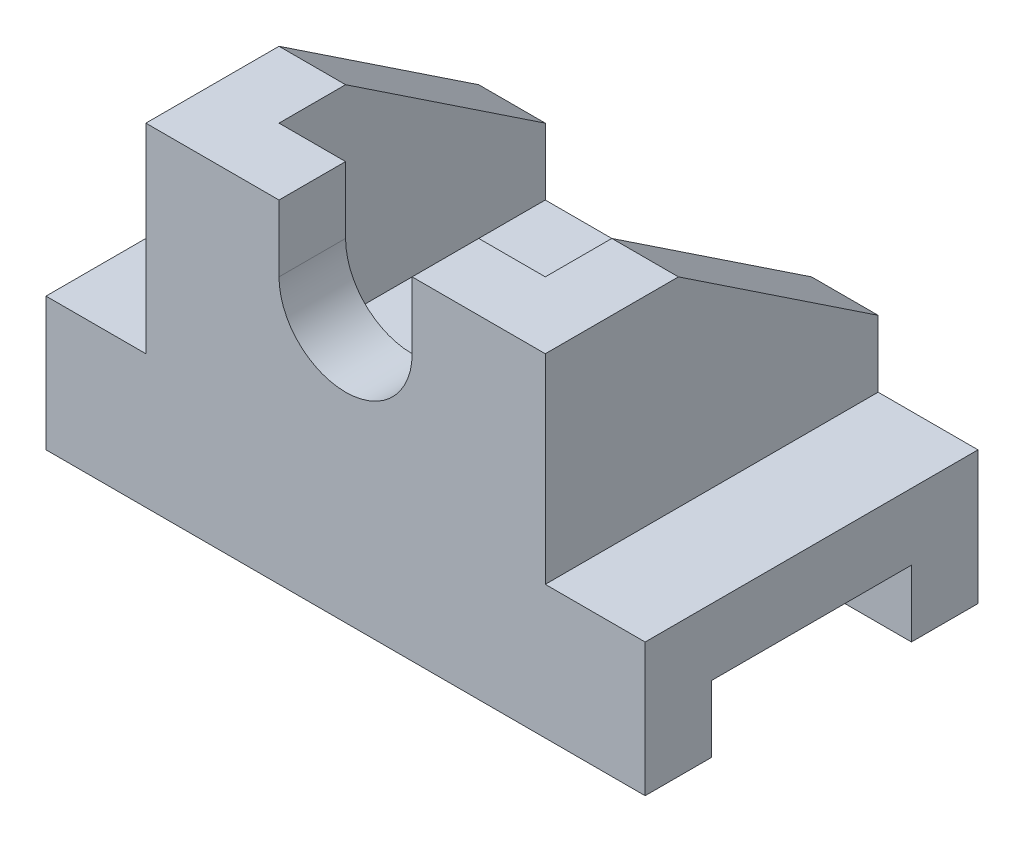
ISO-10303-21;
HEADER;
FILE_DESCRIPTION(('STEP AP214'),'2;1');
FILE_NAME('part.step','',(''),(''),'','','');
FILE_SCHEMA(('AUTOMOTIVE_DESIGN { 1 0 10303 214 1 1 1 1 }'));
ENDSEC;
DATA;
#1=APPLICATION_CONTEXT('core data for automotive mechanical design processes');
#2=APPLICATION_PROTOCOL_DEFINITION('international standard','automotive_design',2000,#1);
#3=PRODUCT_CONTEXT('',#1,'mechanical');
#4=PRODUCT('Part','Part','',(#3));
#5=PRODUCT_RELATED_PRODUCT_CATEGORY('part','',(#4));
#6=PRODUCT_DEFINITION_FORMATION('','',#4);
#7=PRODUCT_DEFINITION_CONTEXT('part definition',#1,'design');
#8=PRODUCT_DEFINITION('design','',#6,#7);
#9=PRODUCT_DEFINITION_SHAPE('','',#8);
#10=(LENGTH_UNIT() NAMED_UNIT(*) SI_UNIT(.MILLI.,.METRE.));
#11=(NAMED_UNIT(*) PLANE_ANGLE_UNIT() SI_UNIT($,.RADIAN.));
#12=(NAMED_UNIT(*) SI_UNIT($,.STERADIAN.) SOLID_ANGLE_UNIT());
#13=UNCERTAINTY_MEASURE_WITH_UNIT(LENGTH_MEASURE(1.E-05),#10,'distance_accuracy_value','');
#14=(GEOMETRIC_REPRESENTATION_CONTEXT(3) GLOBAL_UNCERTAINTY_ASSIGNED_CONTEXT((#13)) GLOBAL_UNIT_ASSIGNED_CONTEXT((#10,
#11,#12)) REPRESENTATION_CONTEXT('',''));
#15=CARTESIAN_POINT('',(0.,0.,0.));
#16=DIRECTION('',(0.,0.,1.));
#17=DIRECTION('',(1.,0.,0.));
#18=AXIS2_PLACEMENT_3D('',#15,#16,#17);
#19=CARTESIAN_POINT('',(60.,60.,10.));
#20=DIRECTION('',(0.,-1.,0.));
#21=DIRECTION('',(0.,0.,-1.));
#22=AXIS2_PLACEMENT_3D('',#19,#20,#21);
#23=PLANE('',#22);
#24=DIRECTION('',(0.,0.,1.));
#25=VECTOR('',#24,1.);
#26=CARTESIAN_POINT('',(-20.,60.,10.));
#27=LINE('',#26,#25);
#28=CARTESIAN_POINT('',(-20.,60.,30.));
#29=VERTEX_POINT('',#28);
#30=CARTESIAN_POINT('',(-20.,60.,50.));
#31=VERTEX_POINT('',#30);
#32=EDGE_CURVE('E223',#29,#31,#27,.T.);
#33=ORIENTED_EDGE('',*,*,#32,.F.);
#34=DIRECTION('',(1.,0.,0.));
#35=VECTOR('',#34,1.);
#36=CARTESIAN_POINT('',(40.,60.,30.));
#37=LINE('',#36,#35);
#38=CARTESIAN_POINT('',(-40.,60.,30.));
#39=VERTEX_POINT('',#38);
#40=EDGE_CURVE('E239',#39,#29,#37,.T.);
#41=ORIENTED_EDGE('',*,*,#40,.F.);
#42=DIRECTION('',(0.,0.,-1.));
#43=VECTOR('',#42,1.);
#44=CARTESIAN_POINT('',(-40.,60.,30.));
#45=LINE('',#44,#43);
#46=CARTESIAN_POINT('',(-40.,60.,10.));
#47=VERTEX_POINT('',#46);
#48=EDGE_CURVE('E251',#39,#47,#45,.T.);
#49=ORIENTED_EDGE('',*,*,#48,.T.);
#50=DIRECTION('',(-1.,0.,0.));
#51=VECTOR('',#50,1.);
#52=CARTESIAN_POINT('',(60.,60.,10.));
#53=LINE('',#52,#51);
#54=CARTESIAN_POINT('',(-60.,60.,10.));
#55=VERTEX_POINT('',#54);
#56=EDGE_CURVE('E314',#47,#55,#53,.T.);
#57=ORIENTED_EDGE('',*,*,#56,.T.);
#58=DIRECTION('',(0.,0.,1.));
#59=VECTOR('',#58,1.);
#60=CARTESIAN_POINT('',(-60.,60.,10.));
#61=LINE('',#60,#59);
#62=CARTESIAN_POINT('',(-60.,60.,50.));
#63=VERTEX_POINT('',#62);
#64=EDGE_CURVE('E308',#55,#63,#61,.T.);
#65=ORIENTED_EDGE('',*,*,#64,.T.);
#66=DIRECTION('',(-1.,0.,0.));
#67=VECTOR('',#66,1.);
#68=CARTESIAN_POINT('',(60.,60.,50.));
#69=LINE('',#68,#67);
#70=EDGE_CURVE('E300',#31,#63,#69,.T.);
#71=ORIENTED_EDGE('',*,*,#70,.F.);
#72=EDGE_LOOP('',(#33,#41,#49,#57,#65,#71));
#73=FACE_BOUND('',#72,.T.);
#74=ADVANCED_FACE('F45',(#73),#23,.F.);
#75=CARTESIAN_POINT('',(60.,20.,-50.));
#76=DIRECTION('',(0.,-0.832050294337844,0.554700196225229));
#77=DIRECTION('',(0.,-0.554700196225229,-0.832050294337844));
#78=AXIS2_PLACEMENT_3D('',#75,#76,#77);
#79=PLANE('',#78);
#80=DIRECTION('',(-1.,0.,0.));
#81=VECTOR('',#80,1.);
#82=CARTESIAN_POINT('',(60.,20.,-50.));
#83=LINE('',#82,#81);
#84=CARTESIAN_POINT('',(60.,20.,-50.));
#85=VERTEX_POINT('',#84);
#86=CARTESIAN_POINT('',(40.,20.,-50.));
#87=VERTEX_POINT('',#86);
#88=EDGE_CURVE('E319',#85,#87,#83,.T.);
#89=ORIENTED_EDGE('',*,*,#88,.T.);
#90=DIRECTION('',(0.,0.554700196225229,0.832050294337844));
#91=VECTOR('',#90,1.);
#92=CARTESIAN_POINT('',(40.,20.,-50.));
#93=LINE('',#92,#91);
#94=CARTESIAN_POINT('',(40.,60.,10.));
#95=VERTEX_POINT('',#94);
#96=EDGE_CURVE('E260',#87,#95,#93,.T.);
#97=ORIENTED_EDGE('',*,*,#96,.T.);
#98=CARTESIAN_POINT('',(60.,60.,10.));
#99=VERTEX_POINT('',#98);
#100=EDGE_CURVE('E315',#99,#95,#53,.T.);
#101=ORIENTED_EDGE('',*,*,#100,.F.);
#102=DIRECTION('',(0.,0.554700196225229,0.832050294337844));
#103=VECTOR('',#102,1.);
#104=CARTESIAN_POINT('',(60.,20.,-50.));
#105=LINE('',#104,#103);
#106=EDGE_CURVE('E293',#85,#99,#105,.T.);
#107=ORIENTED_EDGE('',*,*,#106,.F.);
#108=EDGE_LOOP('',(#89,#97,#101,#107));
#109=FACE_BOUND('',#108,.T.);
#110=ADVANCED_FACE('F426',(#109),#79,.F.);
#111=CARTESIAN_POINT('',(0.,-40.,0.));
#112=DIRECTION('',(0.,1.,0.));
#113=DIRECTION('',(0.,0.,1.));
#114=AXIS2_PLACEMENT_3D('',#111,#112,#113);
#115=PLANE('',#114);
#116=DIRECTION('',(0.,0.,-1.));
#117=VECTOR('',#116,1.);
#118=CARTESIAN_POINT('',(90.,-40.,-50.));
#119=LINE('',#118,#117);
#120=CARTESIAN_POINT('',(90.,-40.,-30.));
#121=VERTEX_POINT('',#120);
#122=CARTESIAN_POINT('',(90.,-40.,-50.));
#123=VERTEX_POINT('',#122);
#124=EDGE_CURVE('E327',#121,#123,#119,.T.);
#125=ORIENTED_EDGE('',*,*,#124,.F.);
#126=DIRECTION('',(-1.,0.,0.));
#127=VECTOR('',#126,1.);
#128=CARTESIAN_POINT('',(0.,-40.,-30.));
#129=LINE('',#128,#127);
#130=CARTESIAN_POINT('',(-90.,-40.,-30.));
#131=VERTEX_POINT('',#130);
#132=EDGE_CURVE('E361',#121,#131,#129,.T.);
#133=ORIENTED_EDGE('',*,*,#132,.T.);
#134=DIRECTION('',(0.,0.,1.));
#135=VECTOR('',#134,1.);
#136=CARTESIAN_POINT('',(-90.,-40.,-50.));
#137=LINE('',#136,#135);
#138=CARTESIAN_POINT('',(-90.,-40.,-50.));
#139=VERTEX_POINT('',#138);
#140=EDGE_CURVE('E331',#139,#131,#137,.T.);
#141=ORIENTED_EDGE('',*,*,#140,.F.);
#142=DIRECTION('',(-1.,0.,0.));
#143=VECTOR('',#142,1.);
#144=CARTESIAN_POINT('',(-90.,-40.,-50.));
#145=LINE('',#144,#143);
#146=EDGE_CURVE('E326',#123,#139,#145,.T.);
#147=ORIENTED_EDGE('',*,*,#146,.F.);
#148=EDGE_LOOP('',(#125,#133,#141,#147));
#149=FACE_BOUND('',#148,.T.);
#150=ADVANCED_FACE('F450',(#149),#115,.F.);
#151=CARTESIAN_POINT('',(0.,0.,0.));
#152=DIRECTION('',(0.,1.,0.));
#153=DIRECTION('',(0.,0.,1.));
#154=AXIS2_PLACEMENT_3D('',#151,#152,#153);
#155=PLANE('',#154);
#156=DIRECTION('',(1.,0.,0.));
#157=VECTOR('',#156,1.);
#158=CARTESIAN_POINT('',(-90.,0.,50.));
#159=LINE('',#158,#157);
#160=CARTESIAN_POINT('',(-90.,0.,50.));
#161=VERTEX_POINT('',#160);
#162=CARTESIAN_POINT('',(-60.,0.,50.));
#163=VERTEX_POINT('',#162);
#164=EDGE_CURVE('E347',#161,#163,#159,.T.);
#165=ORIENTED_EDGE('',*,*,#164,.T.);
#166=DIRECTION('',(0.,0.,-1.));
#167=VECTOR('',#166,1.);
#168=CARTESIAN_POINT('',(-60.,0.,50.));
#169=LINE('',#168,#167);
#170=CARTESIAN_POINT('',(-60.,0.,-50.));
#171=VERTEX_POINT('',#170);
#172=EDGE_CURVE('E283',#163,#171,#169,.T.);
#173=ORIENTED_EDGE('',*,*,#172,.T.);
#174=DIRECTION('',(-1.,0.,0.));
#175=VECTOR('',#174,1.);
#176=CARTESIAN_POINT('',(-90.,0.,-50.));
#177=LINE('',#176,#175);
#178=CARTESIAN_POINT('',(-90.,0.,-50.));
#179=VERTEX_POINT('',#178);
#180=EDGE_CURVE('E340',#171,#179,#177,.T.);
#181=ORIENTED_EDGE('',*,*,#180,.T.);
#182=DIRECTION('',(0.,0.,1.));
#183=VECTOR('',#182,1.);
#184=CARTESIAN_POINT('',(-90.,0.,-50.));
#185=LINE('',#184,#183);
#186=EDGE_CURVE('E343',#179,#161,#185,.T.);
#187=ORIENTED_EDGE('',*,*,#186,.T.);
#188=EDGE_LOOP('',(#165,#173,#181,#187));
#189=FACE_BOUND('',#188,.T.);
#190=ADVANCED_FACE('F392',(#189),#155,.T.);
#191=CARTESIAN_POINT('',(90.,-40.,-50.));
#192=DIRECTION('',(1.,0.,0.));
#193=DIRECTION('',(0.,0.,-1.));
#194=AXIS2_PLACEMENT_3D('',#191,#192,#193);
#195=PLANE('',#194);
#196=DIRECTION('',(0.,1.,0.));
#197=VECTOR('',#196,1.);
#198=CARTESIAN_POINT('',(90.,-60.,-30.));
#199=LINE('',#198,#197);
#200=CARTESIAN_POINT('',(90.,-20.,-30.));
#201=VERTEX_POINT('',#200);
#202=EDGE_CURVE('E263',#121,#201,#199,.T.);
#203=ORIENTED_EDGE('',*,*,#202,.F.);
#204=ORIENTED_EDGE('',*,*,#124,.T.);
#205=DIRECTION('',(0.,1.,0.));
#206=VECTOR('',#205,1.);
#207=CARTESIAN_POINT('',(90.,-40.,-50.));
#208=LINE('',#207,#206);
#209=CARTESIAN_POINT('',(90.,0.,-50.));
#210=VERTEX_POINT('',#209);
#211=EDGE_CURVE('E337',#123,#210,#208,.T.);
#212=ORIENTED_EDGE('',*,*,#211,.T.);
#213=DIRECTION('',(0.,0.,-1.));
#214=VECTOR('',#213,1.);
#215=CARTESIAN_POINT('',(90.,0.,-50.));
#216=LINE('',#215,#214);
#217=CARTESIAN_POINT('',(90.,0.,50.));
#218=VERTEX_POINT('',#217);
#219=EDGE_CURVE('E322',#218,#210,#216,.T.);
#220=ORIENTED_EDGE('',*,*,#219,.F.);
#221=DIRECTION('',(0.,1.,0.));
#222=VECTOR('',#221,1.);
#223=CARTESIAN_POINT('',(90.,-40.,50.));
#224=LINE('',#223,#222);
#225=CARTESIAN_POINT('',(90.,-40.,50.));
#226=VERTEX_POINT('',#225);
#227=EDGE_CURVE('E349',#226,#218,#224,.T.);
#228=ORIENTED_EDGE('',*,*,#227,.F.);
#229=CARTESIAN_POINT('',(90.,-40.,30.));
#230=VERTEX_POINT('',#229);
#231=EDGE_CURVE('E323',#226,#230,#119,.T.);
#232=ORIENTED_EDGE('',*,*,#231,.T.);
#233=DIRECTION('',(0.,-1.,0.));
#234=VECTOR('',#233,1.);
#235=CARTESIAN_POINT('',(90.,-60.,30.));
#236=LINE('',#235,#234);
#237=CARTESIAN_POINT('',(90.,-20.,30.));
#238=VERTEX_POINT('',#237);
#239=EDGE_CURVE('E268',#238,#230,#236,.T.);
#240=ORIENTED_EDGE('',*,*,#239,.F.);
#241=DIRECTION('',(0.,0.,1.));
#242=VECTOR('',#241,1.);
#243=CARTESIAN_POINT('',(90.,-20.,30.));
#244=LINE('',#243,#242);
#245=EDGE_CURVE('E277',#201,#238,#244,.T.);
#246=ORIENTED_EDGE('',*,*,#245,.F.);
#247=EDGE_LOOP('',(#203,#204,#212,#220,#228,#232,#240,#246));
#248=FACE_BOUND('',#247,.T.);
#249=ADVANCED_FACE('F47',(#248),#195,.T.);
#250=CARTESIAN_POINT('',(-90.,-40.,50.));
#251=DIRECTION('',(0.,0.,1.));
#252=DIRECTION('',(1.,0.,0.));
#253=AXIS2_PLACEMENT_3D('',#250,#251,#252);
#254=PLANE('',#253);
#255=DIRECTION('',(0.,-1.,0.));
#256=VECTOR('',#255,1.);
#257=CARTESIAN_POINT('',(20.,0.,50.));
#258=LINE('',#257,#256);
#259=CARTESIAN_POINT('',(20.,60.,50.));
#260=VERTEX_POINT('',#259);
#261=CARTESIAN_POINT('',(20.,40.,50.));
#262=VERTEX_POINT('',#261);
#263=EDGE_CURVE('E197',#260,#262,#258,.T.);
#264=ORIENTED_EDGE('',*,*,#263,.T.);
#265=CARTESIAN_POINT('',(0.,40.,50.));
#266=DIRECTION('',(0.,0.,-1.));
#267=DIRECTION('',(-1.,0.,0.));
#268=AXIS2_PLACEMENT_3D('',#265,#266,#267);
#269=CIRCLE('',#268,20.);
#270=CARTESIAN_POINT('',(-20.,40.,50.));
#271=VERTEX_POINT('',#270);
#272=EDGE_CURVE('E205',#262,#271,#269,.T.);
#273=ORIENTED_EDGE('',*,*,#272,.T.);
#274=DIRECTION('',(0.,-1.,0.));
#275=VECTOR('',#274,1.);
#276=CARTESIAN_POINT('',(-20.,0.,50.));
#277=LINE('',#276,#275);
#278=EDGE_CURVE('E201',#31,#271,#277,.T.);
#279=ORIENTED_EDGE('',*,*,#278,.F.);
#280=ORIENTED_EDGE('',*,*,#70,.T.);
#281=DIRECTION('',(0.,-1.,0.));
#282=VECTOR('',#281,1.);
#283=CARTESIAN_POINT('',(-60.,60.,50.));
#284=LINE('',#283,#282);
#285=EDGE_CURVE('E291',#63,#163,#284,.T.);
#286=ORIENTED_EDGE('',*,*,#285,.T.);
#287=ORIENTED_EDGE('',*,*,#164,.F.);
#288=DIRECTION('',(0.,1.,0.));
#289=VECTOR('',#288,1.);
#290=CARTESIAN_POINT('',(-90.,-40.,50.));
#291=LINE('',#290,#289);
#292=CARTESIAN_POINT('',(-90.,-40.,50.));
#293=VERTEX_POINT('',#292);
#294=EDGE_CURVE('E353',#293,#161,#291,.T.);
#295=ORIENTED_EDGE('',*,*,#294,.F.);
#296=DIRECTION('',(1.,0.,0.));
#297=VECTOR('',#296,1.);
#298=CARTESIAN_POINT('',(-90.,-40.,50.));
#299=LINE('',#298,#297);
#300=EDGE_CURVE('E334',#293,#226,#299,.T.);
#301=ORIENTED_EDGE('',*,*,#300,.T.);
#302=ORIENTED_EDGE('',*,*,#227,.T.);
#303=CARTESIAN_POINT('',(59.9999999999999,0.,50.));
#304=VERTEX_POINT('',#303);
#305=EDGE_CURVE('E346',#304,#218,#159,.T.);
#306=ORIENTED_EDGE('',*,*,#305,.F.);
#307=DIRECTION('',(0.,-1.,0.));
#308=VECTOR('',#307,1.);
#309=CARTESIAN_POINT('',(60.,60.,50.));
#310=LINE('',#309,#308);
#311=CARTESIAN_POINT('',(60.,60.,50.));
#312=VERTEX_POINT('',#311);
#313=EDGE_CURVE('E297',#312,#304,#310,.T.);
#314=ORIENTED_EDGE('',*,*,#313,.F.);
#315=EDGE_CURVE('E214',#312,#260,#69,.T.);
#316=ORIENTED_EDGE('',*,*,#315,.T.);
#317=EDGE_LOOP('',(#264,#273,#279,#280,#286,#287,#295,#301,#302,#306,#314,#316));
#318=FACE_BOUND('',#317,.T.);
#319=ADVANCED_FACE('F211',(#318),#254,.T.);
#320=CARTESIAN_POINT('',(-90.,-40.,-50.));
#321=DIRECTION('',(-1.,0.,0.));
#322=DIRECTION('',(0.,0.,1.));
#323=AXIS2_PLACEMENT_3D('',#320,#321,#322);
#324=PLANE('',#323);
#325=DIRECTION('',(0.,1.,0.));
#326=VECTOR('',#325,1.);
#327=CARTESIAN_POINT('',(-90.,-60.,-30.));
#328=LINE('',#327,#326);
#329=CARTESIAN_POINT('',(-90.,-20.,-30.));
#330=VERTEX_POINT('',#329);
#331=EDGE_CURVE('E264',#131,#330,#328,.T.);
#332=ORIENTED_EDGE('',*,*,#331,.T.);
#333=DIRECTION('',(0.,0.,1.));
#334=VECTOR('',#333,1.);
#335=CARTESIAN_POINT('',(-90.,-20.,30.));
#336=LINE('',#335,#334);
#337=CARTESIAN_POINT('',(-90.,-20.,30.));
#338=VERTEX_POINT('',#337);
#339=EDGE_CURVE('E267',#330,#338,#336,.T.);
#340=ORIENTED_EDGE('',*,*,#339,.T.);
#341=DIRECTION('',(0.,-1.,0.));
#342=VECTOR('',#341,1.);
#343=CARTESIAN_POINT('',(-90.,-60.,30.));
#344=LINE('',#343,#342);
#345=CARTESIAN_POINT('',(-90.,-40.,30.));
#346=VERTEX_POINT('',#345);
#347=EDGE_CURVE('E271',#338,#346,#344,.T.);
#348=ORIENTED_EDGE('',*,*,#347,.T.);
#349=EDGE_CURVE('E330',#346,#293,#137,.T.);
#350=ORIENTED_EDGE('',*,*,#349,.T.);
#351=ORIENTED_EDGE('',*,*,#294,.T.);
#352=ORIENTED_EDGE('',*,*,#186,.F.);
#353=DIRECTION('',(0.,1.,0.));
#354=VECTOR('',#353,1.);
#355=CARTESIAN_POINT('',(-90.,-40.,-50.));
#356=LINE('',#355,#354);
#357=EDGE_CURVE('E355',#139,#179,#356,.T.);
#358=ORIENTED_EDGE('',*,*,#357,.F.);
#359=ORIENTED_EDGE('',*,*,#140,.T.);
#360=EDGE_LOOP('',(#332,#340,#348,#350,#351,#352,#358,#359));
#361=FACE_BOUND('',#360,.T.);
#362=ADVANCED_FACE('F396',(#361),#324,.T.);
#363=CARTESIAN_POINT('',(-90.,-40.,-50.));
#364=DIRECTION('',(0.,0.,-1.));
#365=DIRECTION('',(-1.,0.,0.));
#366=AXIS2_PLACEMENT_3D('',#363,#364,#365);
#367=PLANE('',#366);
#368=DIRECTION('',(0.,-1.,0.));
#369=VECTOR('',#368,1.);
#370=CARTESIAN_POINT('',(40.,0.,-50.));
#371=LINE('',#370,#369);
#372=CARTESIAN_POINT('',(40.,0.,-50.));
#373=VERTEX_POINT('',#372);
#374=EDGE_CURVE('E228',#87,#373,#371,.T.);
#375=ORIENTED_EDGE('',*,*,#374,.F.);
#376=ORIENTED_EDGE('',*,*,#88,.F.);
#377=DIRECTION('',(0.,1.,0.));
#378=VECTOR('',#377,1.);
#379=CARTESIAN_POINT('',(60.,0.,-50.));
#380=LINE('',#379,#378);
#381=CARTESIAN_POINT('',(60.,0.,-50.));
#382=VERTEX_POINT('',#381);
#383=EDGE_CURVE('E290',#382,#85,#380,.T.);
#384=ORIENTED_EDGE('',*,*,#383,.F.);
#385=EDGE_CURVE('E341',#210,#382,#177,.T.);
#386=ORIENTED_EDGE('',*,*,#385,.F.);
#387=ORIENTED_EDGE('',*,*,#211,.F.);
#388=ORIENTED_EDGE('',*,*,#146,.T.);
#389=ORIENTED_EDGE('',*,*,#357,.T.);
#390=ORIENTED_EDGE('',*,*,#180,.F.);
#391=DIRECTION('',(0.,1.,0.));
#392=VECTOR('',#391,1.);
#393=CARTESIAN_POINT('',(-60.,0.,-50.));
#394=LINE('',#393,#392);
#395=CARTESIAN_POINT('',(-60.,20.,-50.));
#396=VERTEX_POINT('',#395);
#397=EDGE_CURVE('E302',#171,#396,#394,.T.);
#398=ORIENTED_EDGE('',*,*,#397,.T.);
#399=CARTESIAN_POINT('',(-40.,20.,-50.));
#400=VERTEX_POINT('',#399);
#401=EDGE_CURVE('E318',#400,#396,#83,.T.);
#402=ORIENTED_EDGE('',*,*,#401,.F.);
#403=DIRECTION('',(0.,1.,0.));
#404=VECTOR('',#403,1.);
#405=CARTESIAN_POINT('',(-40.,0.,-50.));
#406=LINE('',#405,#404);
#407=CARTESIAN_POINT('',(-40.,0.,-50.));
#408=VERTEX_POINT('',#407);
#409=EDGE_CURVE('E233',#408,#400,#406,.T.);
#410=ORIENTED_EDGE('',*,*,#409,.F.);
#411=DIRECTION('',(-1.,0.,0.));
#412=VECTOR('',#411,1.);
#413=CARTESIAN_POINT('',(40.,0.,-50.));
#414=LINE('',#413,#412);
#415=EDGE_CURVE('E244',#373,#408,#414,.T.);
#416=ORIENTED_EDGE('',*,*,#415,.F.);
#417=EDGE_LOOP('',(#375,#376,#384,#386,#387,#388,#389,#390,#398,#402,#410,#416));
#418=FACE_BOUND('',#417,.T.);
#419=ADVANCED_FACE('F430',(#418),#367,.T.);
#420=ORIENTED_EDGE('',*,*,#349,.F.);
#421=DIRECTION('',(1.,0.,0.));
#422=VECTOR('',#421,1.);
#423=CARTESIAN_POINT('',(0.,-40.,30.));
#424=LINE('',#423,#422);
#425=EDGE_CURVE('E352',#346,#230,#424,.T.);
#426=ORIENTED_EDGE('',*,*,#425,.T.);
#427=ORIENTED_EDGE('',*,*,#231,.F.);
#428=ORIENTED_EDGE('',*,*,#300,.F.);
#429=EDGE_LOOP('',(#420,#426,#427,#428));
#430=FACE_BOUND('',#429,.T.);
#431=ADVANCED_FACE('F401',(#430),#115,.F.);
#432=DIRECTION('',(0.,0.,-1.));
#433=VECTOR('',#432,1.);
#434=CARTESIAN_POINT('',(60.,0.,50.));
#435=LINE('',#434,#433);
#436=EDGE_CURVE('E287',#304,#382,#435,.T.);
#437=ORIENTED_EDGE('',*,*,#436,.F.);
#438=ORIENTED_EDGE('',*,*,#305,.T.);
#439=ORIENTED_EDGE('',*,*,#219,.T.);
#440=ORIENTED_EDGE('',*,*,#385,.T.);
#441=EDGE_LOOP('',(#437,#438,#439,#440));
#442=FACE_BOUND('',#441,.T.);
#443=ADVANCED_FACE('F410',(#442),#155,.T.);
#444=ORIENTED_EDGE('',*,*,#56,.F.);
#445=DIRECTION('',(0.,-0.554700196225229,-0.832050294337844));
#446=VECTOR('',#445,1.);
#447=CARTESIAN_POINT('',(-40.,20.,-50.));
#448=LINE('',#447,#446);
#449=EDGE_CURVE('E250',#47,#400,#448,.T.);
#450=ORIENTED_EDGE('',*,*,#449,.T.);
#451=ORIENTED_EDGE('',*,*,#401,.T.);
#452=DIRECTION('',(0.,0.554700196225229,0.832050294337844));
#453=VECTOR('',#452,1.);
#454=CARTESIAN_POINT('',(-60.,20.,-50.));
#455=LINE('',#454,#453);
#456=EDGE_CURVE('E305',#396,#55,#455,.T.);
#457=ORIENTED_EDGE('',*,*,#456,.T.);
#458=EDGE_LOOP('',(#444,#450,#451,#457));
#459=FACE_BOUND('',#458,.T.);
#460=ADVANCED_FACE('F379',(#459),#79,.F.);
#461=CARTESIAN_POINT('',(20.,60.,30.));
#462=VERTEX_POINT('',#461);
#463=CARTESIAN_POINT('',(40.,60.,30.));
#464=VERTEX_POINT('',#463);
#465=EDGE_CURVE('E238',#462,#464,#37,.T.);
#466=ORIENTED_EDGE('',*,*,#465,.F.);
#467=DIRECTION('',(0.,0.,1.));
#468=VECTOR('',#467,1.);
#469=CARTESIAN_POINT('',(20.,60.,10.));
#470=LINE('',#469,#468);
#471=EDGE_CURVE('E226',#462,#260,#470,.T.);
#472=ORIENTED_EDGE('',*,*,#471,.T.);
#473=ORIENTED_EDGE('',*,*,#315,.F.);
#474=DIRECTION('',(0.,0.,1.));
#475=VECTOR('',#474,1.);
#476=CARTESIAN_POINT('',(60.,60.,10.));
#477=LINE('',#476,#475);
#478=EDGE_CURVE('E295',#99,#312,#477,.T.);
#479=ORIENTED_EDGE('',*,*,#478,.F.);
#480=ORIENTED_EDGE('',*,*,#100,.T.);
#481=DIRECTION('',(0.,0.,-1.));
#482=VECTOR('',#481,1.);
#483=CARTESIAN_POINT('',(40.,60.,30.));
#484=LINE('',#483,#482);
#485=EDGE_CURVE('E248',#464,#95,#484,.T.);
#486=ORIENTED_EDGE('',*,*,#485,.F.);
#487=EDGE_LOOP('',(#466,#472,#473,#479,#480,#486));
#488=FACE_BOUND('',#487,.T.);
#489=ADVANCED_FACE('F420',(#488),#23,.F.);
#490=CARTESIAN_POINT('',(60.,0.,0.));
#491=DIRECTION('',(1.,0.,0.));
#492=DIRECTION('',(0.,0.,-1.));
#493=AXIS2_PLACEMENT_3D('',#490,#491,#492);
#494=PLANE('',#493);
#495=ORIENTED_EDGE('',*,*,#436,.T.);
#496=ORIENTED_EDGE('',*,*,#383,.T.);
#497=ORIENTED_EDGE('',*,*,#106,.T.);
#498=ORIENTED_EDGE('',*,*,#478,.T.);
#499=ORIENTED_EDGE('',*,*,#313,.T.);
#500=EDGE_LOOP('',(#495,#496,#497,#498,#499));
#501=FACE_BOUND('',#500,.T.);
#502=ADVANCED_FACE('F413',(#501),#494,.T.);
#503=CARTESIAN_POINT('',(-60.,0.,0.));
#504=DIRECTION('',(1.,0.,0.));
#505=DIRECTION('',(0.,0.,-1.));
#506=AXIS2_PLACEMENT_3D('',#503,#504,#505);
#507=PLANE('',#506);
#508=ORIENTED_EDGE('',*,*,#172,.F.);
#509=ORIENTED_EDGE('',*,*,#285,.F.);
#510=ORIENTED_EDGE('',*,*,#64,.F.);
#511=ORIENTED_EDGE('',*,*,#456,.F.);
#512=ORIENTED_EDGE('',*,*,#397,.F.);
#513=EDGE_LOOP('',(#508,#509,#510,#511,#512));
#514=FACE_BOUND('',#513,.T.);
#515=ADVANCED_FACE('F387',(#514),#507,.F.);
#516=CARTESIAN_POINT('',(-90.,-60.,-30.));
#517=DIRECTION('',(0.,0.,-1.));
#518=DIRECTION('',(-1.,0.,0.));
#519=AXIS2_PLACEMENT_3D('',#516,#517,#518);
#520=PLANE('',#519);
#521=ORIENTED_EDGE('',*,*,#202,.T.);
#522=DIRECTION('',(1.,0.,0.));
#523=VECTOR('',#522,1.);
#524=CARTESIAN_POINT('',(-90.,-20.,-30.));
#525=LINE('',#524,#523);
#526=CARTESIAN_POINT('',(0.,-20.,-30.));
#527=VERTEX_POINT('',#526);
#528=EDGE_CURVE('E274',#527,#201,#525,.T.);
#529=ORIENTED_EDGE('',*,*,#528,.F.);
#530=EDGE_CURVE('E284',#330,#527,#525,.T.);
#531=ORIENTED_EDGE('',*,*,#530,.F.);
#532=ORIENTED_EDGE('',*,*,#331,.F.);
#533=ORIENTED_EDGE('',*,*,#132,.F.);
#534=EDGE_LOOP('',(#521,#529,#531,#532,#533));
#535=FACE_BOUND('',#534,.T.);
#536=ADVANCED_FACE('F504',(#535),#520,.F.);
#537=CARTESIAN_POINT('',(-90.,-60.,30.));
#538=DIRECTION('',(0.,0.,1.));
#539=DIRECTION('',(1.,0.,0.));
#540=AXIS2_PLACEMENT_3D('',#537,#538,#539);
#541=PLANE('',#540);
#542=ORIENTED_EDGE('',*,*,#347,.F.);
#543=DIRECTION('',(1.,0.,0.));
#544=VECTOR('',#543,1.);
#545=CARTESIAN_POINT('',(-90.,-20.,30.));
#546=LINE('',#545,#544);
#547=EDGE_CURVE('E281',#338,#238,#546,.T.);
#548=ORIENTED_EDGE('',*,*,#547,.T.);
#549=ORIENTED_EDGE('',*,*,#239,.T.);
#550=ORIENTED_EDGE('',*,*,#425,.F.);
#551=EDGE_LOOP('',(#542,#548,#549,#550));
#552=FACE_BOUND('',#551,.T.);
#553=ADVANCED_FACE('F589',(#552),#541,.F.);
#554=CARTESIAN_POINT('',(-90.,-20.,30.));
#555=DIRECTION('',(0.,1.,0.));
#556=DIRECTION('',(0.,0.,1.));
#557=AXIS2_PLACEMENT_3D('',#554,#555,#556);
#558=PLANE('',#557);
#559=ORIENTED_EDGE('',*,*,#530,.T.);
#560=CARTESIAN_POINT('',(0.,-20.,-10.));
#561=DIRECTION('',(0.,1.,0.));
#562=DIRECTION('',(-1.,0.,0.));
#563=AXIS2_PLACEMENT_3D('',#560,#561,#562);
#564=CIRCLE('',#563,20.);
#565=EDGE_CURVE('E58',#527,#527,#564,.T.);
#566=ORIENTED_EDGE('',*,*,#565,.T.);
#567=ORIENTED_EDGE('',*,*,#528,.T.);
#568=ORIENTED_EDGE('',*,*,#245,.T.);
#569=ORIENTED_EDGE('',*,*,#547,.F.);
#570=ORIENTED_EDGE('',*,*,#339,.F.);
#571=EDGE_LOOP('',(#559,#566,#567,#568,#569,#570));
#572=FACE_BOUND('',#571,.T.);
#573=ADVANCED_FACE('F597',(#572),#558,.F.);
#574=CARTESIAN_POINT('',(40.,0.,30.));
#575=DIRECTION('',(1.,0.,0.));
#576=DIRECTION('',(0.,0.,-1.));
#577=AXIS2_PLACEMENT_3D('',#574,#575,#576);
#578=PLANE('',#577);
#579=ORIENTED_EDGE('',*,*,#374,.T.);
#580=DIRECTION('',(0.,0.,-1.));
#581=VECTOR('',#580,1.);
#582=CARTESIAN_POINT('',(40.,0.,30.));
#583=LINE('',#582,#581);
#584=CARTESIAN_POINT('',(40.,0.,30.));
#585=VERTEX_POINT('',#584);
#586=EDGE_CURVE('E242',#585,#373,#583,.T.);
#587=ORIENTED_EDGE('',*,*,#586,.F.);
#588=DIRECTION('',(0.,-1.,0.));
#589=VECTOR('',#588,1.);
#590=CARTESIAN_POINT('',(40.,0.,30.));
#591=LINE('',#590,#589);
#592=EDGE_CURVE('E229',#464,#585,#591,.T.);
#593=ORIENTED_EDGE('',*,*,#592,.F.);
#594=ORIENTED_EDGE('',*,*,#485,.T.);
#595=ORIENTED_EDGE('',*,*,#96,.F.);
#596=EDGE_LOOP('',(#579,#587,#593,#594,#595));
#597=FACE_BOUND('',#596,.T.);
#598=ADVANCED_FACE('F424',(#597),#578,.F.);
#599=CARTESIAN_POINT('',(-40.,0.,30.));
#600=DIRECTION('',(-1.,0.,0.));
#601=DIRECTION('',(0.,-1.,0.));
#602=AXIS2_PLACEMENT_3D('',#599,#600,#601);
#603=PLANE('',#602);
#604=ORIENTED_EDGE('',*,*,#48,.F.);
#605=DIRECTION('',(0.,1.,0.));
#606=VECTOR('',#605,1.);
#607=CARTESIAN_POINT('',(-40.,0.,30.));
#608=LINE('',#607,#606);
#609=CARTESIAN_POINT('',(-40.,0.,30.));
#610=VERTEX_POINT('',#609);
#611=EDGE_CURVE('E236',#610,#39,#608,.T.);
#612=ORIENTED_EDGE('',*,*,#611,.F.);
#613=DIRECTION('',(0.,0.,-1.));
#614=VECTOR('',#613,1.);
#615=CARTESIAN_POINT('',(-40.,0.,30.));
#616=LINE('',#615,#614);
#617=EDGE_CURVE('E254',#610,#408,#616,.T.);
#618=ORIENTED_EDGE('',*,*,#617,.T.);
#619=ORIENTED_EDGE('',*,*,#409,.T.);
#620=ORIENTED_EDGE('',*,*,#449,.F.);
#621=EDGE_LOOP('',(#604,#612,#618,#619,#620));
#622=FACE_BOUND('',#621,.T.);
#623=ADVANCED_FACE('F376',(#622),#603,.F.);
#624=CARTESIAN_POINT('',(40.,0.,30.));
#625=DIRECTION('',(0.,-1.,0.));
#626=DIRECTION('',(1.,0.,0.));
#627=AXIS2_PLACEMENT_3D('',#624,#625,#626);
#628=PLANE('',#627);
#629=CARTESIAN_POINT('',(0.,0.,-10.));
#630=DIRECTION('',(0.,1.,0.));
#631=DIRECTION('',(-1.,0.,0.));
#632=AXIS2_PLACEMENT_3D('',#629,#630,#631);
#633=CIRCLE('',#632,20.);
#634=CARTESIAN_POINT('',(-20.,0.,-10.));
#635=VERTEX_POINT('',#634);
#636=EDGE_CURVE('E219',#635,#635,#633,.T.);
#637=ORIENTED_EDGE('',*,*,#636,.F.);
#638=EDGE_LOOP('',(#637));
#639=FACE_BOUND('',#638,.T.);
#640=ORIENTED_EDGE('',*,*,#415,.T.);
#641=ORIENTED_EDGE('',*,*,#617,.F.);
#642=DIRECTION('',(-1.,0.,0.));
#643=VECTOR('',#642,1.);
#644=CARTESIAN_POINT('',(40.,0.,30.));
#645=LINE('',#644,#643);
#646=EDGE_CURVE('E232',#585,#610,#645,.T.);
#647=ORIENTED_EDGE('',*,*,#646,.F.);
#648=ORIENTED_EDGE('',*,*,#586,.T.);
#649=EDGE_LOOP('',(#640,#641,#647,#648));
#650=FACE_BOUND('',#649,.T.);
#651=ADVANCED_FACE('F433',(#639,#650),#628,.F.);
#652=CARTESIAN_POINT('',(0.,0.,30.));
#653=DIRECTION('',(0.,0.,1.));
#654=DIRECTION('',(1.,0.,0.));
#655=AXIS2_PLACEMENT_3D('',#652,#653,#654);
#656=PLANE('',#655);
#657=CARTESIAN_POINT('',(0.,40.,30.));
#658=DIRECTION('',(0.,0.,-1.));
#659=DIRECTION('',(-1.,0.,0.));
#660=AXIS2_PLACEMENT_3D('',#657,#658,#659);
#661=CIRCLE('',#660,20.);
#662=CARTESIAN_POINT('',(20.,40.,30.));
#663=VERTEX_POINT('',#662);
#664=CARTESIAN_POINT('',(-20.,40.,30.));
#665=VERTEX_POINT('',#664);
#666=EDGE_CURVE('E215',#663,#665,#661,.T.);
#667=ORIENTED_EDGE('',*,*,#666,.F.);
#668=DIRECTION('',(0.,1.,0.));
#669=VECTOR('',#668,1.);
#670=CARTESIAN_POINT('',(20.,0.,30.));
#671=LINE('',#670,#669);
#672=EDGE_CURVE('E13',#663,#462,#671,.T.);
#673=ORIENTED_EDGE('',*,*,#672,.T.);
#674=ORIENTED_EDGE('',*,*,#465,.T.);
#675=ORIENTED_EDGE('',*,*,#592,.T.);
#676=ORIENTED_EDGE('',*,*,#646,.T.);
#677=ORIENTED_EDGE('',*,*,#611,.T.);
#678=ORIENTED_EDGE('',*,*,#40,.T.);
#679=DIRECTION('',(0.,1.,0.));
#680=VECTOR('',#679,1.);
#681=CARTESIAN_POINT('',(-20.,0.,30.));
#682=LINE('',#681,#680);
#683=EDGE_CURVE('E53',#665,#29,#682,.T.);
#684=ORIENTED_EDGE('',*,*,#683,.F.);
#685=EDGE_LOOP('',(#667,#673,#674,#675,#676,#677,#678,#684));
#686=FACE_BOUND('',#685,.T.);
#687=ADVANCED_FACE('F371',(#686),#656,.F.);
#688=CARTESIAN_POINT('',(20.,0.,50.));
#689=DIRECTION('',(1.,0.,0.));
#690=DIRECTION('',(0.,1.,0.));
#691=AXIS2_PLACEMENT_3D('',#688,#689,#690);
#692=PLANE('',#691);
#693=ORIENTED_EDGE('',*,*,#672,.F.);
#694=DIRECTION('',(0.,0.,-1.));
#695=VECTOR('',#694,1.);
#696=CARTESIAN_POINT('',(20.,40.,50.));
#697=LINE('',#696,#695);
#698=EDGE_CURVE('E65',#262,#663,#697,.T.);
#699=ORIENTED_EDGE('',*,*,#698,.F.);
#700=ORIENTED_EDGE('',*,*,#263,.F.);
#701=ORIENTED_EDGE('',*,*,#471,.F.);
#702=EDGE_LOOP('',(#693,#699,#700,#701));
#703=FACE_BOUND('',#702,.T.);
#704=ADVANCED_FACE('F195',(#703),#692,.F.);
#705=CARTESIAN_POINT('',(-20.,0.,50.));
#706=DIRECTION('',(1.,0.,0.));
#707=DIRECTION('',(0.,1.,0.));
#708=AXIS2_PLACEMENT_3D('',#705,#706,#707);
#709=PLANE('',#708);
#710=ORIENTED_EDGE('',*,*,#32,.T.);
#711=ORIENTED_EDGE('',*,*,#278,.T.);
#712=DIRECTION('',(0.,0.,-1.));
#713=VECTOR('',#712,1.);
#714=CARTESIAN_POINT('',(-20.,40.,50.));
#715=LINE('',#714,#713);
#716=EDGE_CURVE('E200',#271,#665,#715,.T.);
#717=ORIENTED_EDGE('',*,*,#716,.T.);
#718=ORIENTED_EDGE('',*,*,#683,.T.);
#719=EDGE_LOOP('',(#710,#711,#717,#718));
#720=FACE_BOUND('',#719,.T.);
#721=ADVANCED_FACE('F366',(#720),#709,.T.);
#722=CARTESIAN_POINT('',(0.,40.,50.));
#723=DIRECTION('',(0.,0.,-1.));
#724=DIRECTION('',(-1.,0.,0.));
#725=AXIS2_PLACEMENT_3D('',#722,#723,#724);
#726=CYLINDRICAL_SURFACE('',#725,20.);
#727=ORIENTED_EDGE('',*,*,#666,.T.);
#728=ORIENTED_EDGE('',*,*,#716,.F.);
#729=ORIENTED_EDGE('',*,*,#272,.F.);
#730=ORIENTED_EDGE('',*,*,#698,.T.);
#731=EDGE_LOOP('',(#727,#728,#729,#730));
#732=FACE_BOUND('',#731,.T.);
#733=ADVANCED_FACE('F206',(#732),#726,.F.);
#734=CARTESIAN_POINT('',(0.,-20.,-10.));
#735=DIRECTION('',(0.,1.,0.));
#736=DIRECTION('',(-1.,0.,0.));
#737=AXIS2_PLACEMENT_3D('',#734,#735,#736);
#738=CYLINDRICAL_SURFACE('',#737,20.);
#739=ORIENTED_EDGE('',*,*,#565,.F.);
#740=EDGE_LOOP('',(#739));
#741=FACE_BOUND('',#740,.T.);
#742=ORIENTED_EDGE('',*,*,#636,.T.);
#743=EDGE_LOOP('',(#742));
#744=FACE_BOUND('',#743,.T.);
#745=ADVANCED_FACE('F580',(#741,#744),#738,.F.);
#746=CLOSED_SHELL('',(#74,#110,#150,#190,#249,#319,#362,#419,#431,#443,#460,#489,#502,#515,#536,
#553,#573,#598,#623,#651,#687,#704,#721,#733,#745));
#747=MANIFOLD_SOLID_BREP('B2',#746);
#748=ADVANCED_BREP_SHAPE_REPRESENTATION('',(#18,#747),#14);
#749=SHAPE_DEFINITION_REPRESENTATION(#9,#748);
ENDSEC;
END-ISO-10303-21;
